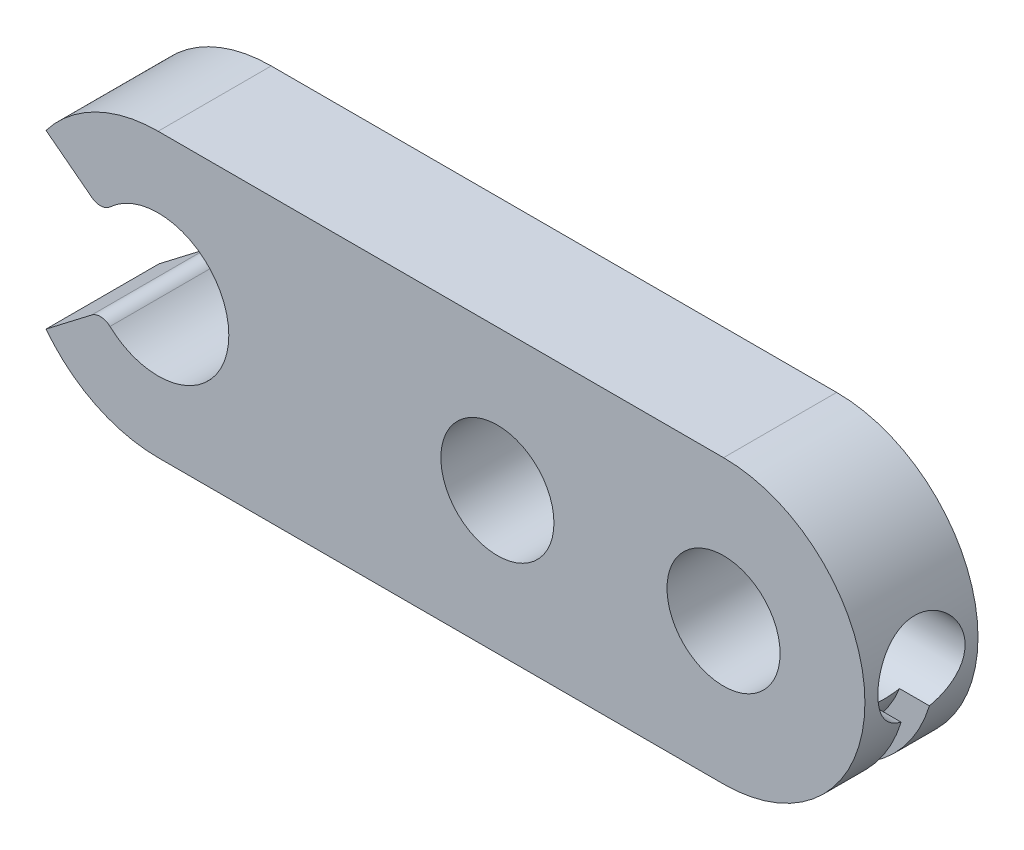
ISO-10303-21;
HEADER;
FILE_DESCRIPTION(('STEP AP214'),'2;1');
FILE_NAME('part.step','',(''),(''),'','','');
FILE_SCHEMA(('AUTOMOTIVE_DESIGN { 1 0 10303 214 1 1 1 1 }'));
ENDSEC;
DATA;
#1=APPLICATION_CONTEXT('core data for automotive mechanical design processes');
#2=APPLICATION_PROTOCOL_DEFINITION('international standard','automotive_design',2000,#1);
#3=PRODUCT_CONTEXT('',#1,'mechanical');
#4=PRODUCT('Part','Part','',(#3));
#5=PRODUCT_RELATED_PRODUCT_CATEGORY('part','',(#4));
#6=PRODUCT_DEFINITION_FORMATION('','',#4);
#7=PRODUCT_DEFINITION_CONTEXT('part definition',#1,'design');
#8=PRODUCT_DEFINITION('design','',#6,#7);
#9=PRODUCT_DEFINITION_SHAPE('','',#8);
#10=(LENGTH_UNIT() NAMED_UNIT(*) SI_UNIT(.MILLI.,.METRE.));
#11=(NAMED_UNIT(*) PLANE_ANGLE_UNIT() SI_UNIT($,.RADIAN.));
#12=(NAMED_UNIT(*) SI_UNIT($,.STERADIAN.) SOLID_ANGLE_UNIT());
#13=UNCERTAINTY_MEASURE_WITH_UNIT(LENGTH_MEASURE(1.E-05),#10,'distance_accuracy_value','');
#14=(GEOMETRIC_REPRESENTATION_CONTEXT(3) GLOBAL_UNCERTAINTY_ASSIGNED_CONTEXT((#13)) GLOBAL_UNIT_ASSIGNED_CONTEXT((#10,
#11,#12)) REPRESENTATION_CONTEXT('',''));
#15=CARTESIAN_POINT('',(0.,0.,0.));
#16=DIRECTION('',(0.,0.,1.));
#17=DIRECTION('',(1.,0.,0.));
#18=AXIS2_PLACEMENT_3D('',#15,#16,#17);
#19=CARTESIAN_POINT('',(0.,0.,4.));
#20=DIRECTION('',(0.,0.,-1.));
#21=DIRECTION('',(-1.,0.,0.));
#22=AXIS2_PLACEMENT_3D('',#19,#20,#21);
#23=CYLINDRICAL_SURFACE('',#22,5.);
#24=CARTESIAN_POINT('',(0.,0.,2.5));
#25=DIRECTION('',(0.,0.,-1.));
#26=DIRECTION('',(-1.,0.,0.));
#27=AXIS2_PLACEMENT_3D('',#24,#25,#26);
#28=CIRCLE('',#27,5.);
#29=CARTESIAN_POINT('',(0.,-4.99999999999545,2.5));
#30=VERTEX_POINT('',#29);
#31=CARTESIAN_POINT('',(-2.9999999999859,-4.0000000000191,2.5));
#32=VERTEX_POINT('',#31);
#33=EDGE_CURVE('E178',#30,#32,#28,.T.);
#34=ORIENTED_EDGE('',*,*,#33,.F.);
#35=DIRECTION('',(0.,0.,-1.));
#36=VECTOR('',#35,1.);
#37=CARTESIAN_POINT('',(0.,-5.,4.));
#38=LINE('',#37,#36);
#39=CARTESIAN_POINT('',(0.,-5.,4.));
#40=VERTEX_POINT('',#39);
#41=EDGE_CURVE('E355',#40,#30,#38,.T.);
#42=ORIENTED_EDGE('',*,*,#41,.F.);
#43=CARTESIAN_POINT('',(0.,0.,4.));
#44=DIRECTION('',(0.,0.,1.));
#45=DIRECTION('',(-1.,0.,0.));
#46=AXIS2_PLACEMENT_3D('',#43,#44,#45);
#47=CIRCLE('',#46,5.);
#48=CARTESIAN_POINT('',(-3.96676670145618,-3.04380714504359,4.));
#49=VERTEX_POINT('',#48);
#50=EDGE_CURVE('E320',#49,#40,#47,.T.);
#51=ORIENTED_EDGE('',*,*,#50,.F.);
#52=DIRECTION('',(0.,0.,-1.));
#53=VECTOR('',#52,1.);
#54=CARTESIAN_POINT('',(-3.96676670145618,-3.04380714504359,4.));
#55=LINE('',#54,#53);
#56=CARTESIAN_POINT('',(-3.96676670145618,-3.04380714504359,0.));
#57=VERTEX_POINT('',#56);
#58=EDGE_CURVE('E358',#49,#57,#55,.T.);
#59=ORIENTED_EDGE('',*,*,#58,.T.);
#60=CARTESIAN_POINT('',(0.,0.,0.));
#61=DIRECTION('',(0.,0.,1.));
#62=DIRECTION('',(-1.,0.,0.));
#63=AXIS2_PLACEMENT_3D('',#60,#61,#62);
#64=CIRCLE('',#63,5.);
#65=CARTESIAN_POINT('',(0.,-5.,0.));
#66=VERTEX_POINT('',#65);
#67=EDGE_CURVE('E336',#57,#66,#64,.T.);
#68=ORIENTED_EDGE('',*,*,#67,.T.);
#69=CARTESIAN_POINT('',(0.,-4.99999999999545,1.5));
#70=VERTEX_POINT('',#69);
#71=EDGE_CURVE('E354',#70,#66,#38,.T.);
#72=ORIENTED_EDGE('',*,*,#71,.F.);
#73=CARTESIAN_POINT('',(0.,0.,1.5));
#74=DIRECTION('',(0.,0.,-1.));
#75=DIRECTION('',(-1.,0.,0.));
#76=AXIS2_PLACEMENT_3D('',#73,#74,#75);
#77=CIRCLE('',#76,5.);
#78=CARTESIAN_POINT('',(-2.9999999999859,-4.0000000000191,1.5));
#79=VERTEX_POINT('',#78);
#80=EDGE_CURVE('E190',#70,#79,#77,.T.);
#81=ORIENTED_EDGE('',*,*,#80,.T.);
#82=DIRECTION('',(0.,0.,-1.));
#83=VECTOR('',#82,1.);
#84=CARTESIAN_POINT('',(-2.9999999999859,-4.0000000000191,2.5));
#85=LINE('',#84,#83);
#86=EDGE_CURVE('E173',#32,#79,#85,.T.);
#87=ORIENTED_EDGE('',*,*,#86,.F.);
#88=EDGE_LOOP('',(#34,#42,#51,#59,#68,#72,#81,#87));
#89=FACE_BOUND('',#88,.T.);
#90=ADVANCED_FACE('F41',(#89),#23,.T.);
#91=CARTESIAN_POINT('',(20.,-5.,4.));
#92=DIRECTION('',(0.,1.,0.));
#93=DIRECTION('',(-1.,0.,0.));
#94=AXIS2_PLACEMENT_3D('',#91,#92,#93);
#95=PLANE('',#94);
#96=DIRECTION('',(-1.,0.,0.));
#97=VECTOR('',#96,1.);
#98=CARTESIAN_POINT('',(400010.516616649,-4.99999999999545,2.5));
#99=LINE('',#98,#97);
#100=CARTESIAN_POINT('',(19.9999999999818,-4.99999999999545,2.5));
#101=VERTEX_POINT('',#100);
#102=EDGE_CURVE('E174',#101,#30,#99,.T.);
#103=ORIENTED_EDGE('',*,*,#102,.F.);
#104=DIRECTION('',(0.,0.,-1.));
#105=VECTOR('',#104,1.);
#106=CARTESIAN_POINT('',(20.,-5.,4.));
#107=LINE('',#106,#105);
#108=CARTESIAN_POINT('',(20.,-5.,4.));
#109=VERTEX_POINT('',#108);
#110=EDGE_CURVE('E351',#109,#101,#107,.T.);
#111=ORIENTED_EDGE('',*,*,#110,.F.);
#112=DIRECTION('',(1.,0.,0.));
#113=VECTOR('',#112,1.);
#114=CARTESIAN_POINT('',(20.,-5.,4.));
#115=LINE('',#114,#113);
#116=EDGE_CURVE('E322',#40,#109,#115,.T.);
#117=ORIENTED_EDGE('',*,*,#116,.F.);
#118=ORIENTED_EDGE('',*,*,#41,.T.);
#119=EDGE_LOOP('',(#103,#111,#117,#118));
#120=FACE_BOUND('',#119,.T.);
#121=ADVANCED_FACE('F244',(#120),#95,.F.);
#122=CARTESIAN_POINT('',(20.,0.,4.));
#123=DIRECTION('',(0.,0.,-1.));
#124=DIRECTION('',(-1.,0.,0.));
#125=AXIS2_PLACEMENT_3D('',#122,#123,#124);
#126=CYLINDRICAL_SURFACE('',#125,5.);
#127=CARTESIAN_POINT('',(19.9999999999999,0.,2.5));
#128=DIRECTION('',(0.,0.,-1.));
#129=DIRECTION('',(-1.,0.,0.));
#130=AXIS2_PLACEMENT_3D('',#127,#128,#129);
#131=CIRCLE('',#130,5.00000000000005);
#132=CARTESIAN_POINT('',(24.7819280564956,-1.46053553962237,2.5));
#133=VERTEX_POINT('',#132);
#134=EDGE_CURVE('E164',#133,#101,#131,.T.);
#135=ORIENTED_EDGE('',*,*,#134,.F.);
#136=CARTESIAN_POINT('',(25.,0.,0.45625));
#137=CARTESIAN_POINT('',(24.999999480161,-0.0845729065723781,0.456250700694102));
#138=CARTESIAN_POINT('',(24.9978338939525,-0.169152999162136,0.463222816589825));
#139=CARTESIAN_POINT('',(24.9894069250978,-0.335842868806745,0.490856070646756));
#140=CARTESIAN_POINT('',(24.9831445263833,-0.41795202774902,0.511520604740073));
#141=CARTESIAN_POINT('',(24.9672086823788,-0.577272076851462,0.565777692587159));
#142=CARTESIAN_POINT('',(24.957540444089,-0.654490233165572,0.599350518690638));
#143=CARTESIAN_POINT('',(24.9357931907344,-0.802201083794746,0.678388167957652));
#144=CARTESIAN_POINT('',(24.9237138135048,-0.872692765406398,0.723854777944919));
#145=CARTESIAN_POINT('',(24.8980200250978,-1.00708063661375,0.826836468076737));
#146=CARTESIAN_POINT('',(24.8843727678398,-1.0707449200213,0.884645955496643));
#147=CARTESIAN_POINT('',(24.8572733152295,-1.18764645332459,1.010045360376));
#148=CARTESIAN_POINT('',(24.8438211555132,-1.2408818199695,1.07763704047635));
#149=CARTESIAN_POINT('',(24.8182840618331,-1.33666051876377,1.22267596990992));
#150=CARTESIAN_POINT('',(24.80623975242,-1.37891616598629,1.3003210258804));
#151=CARTESIAN_POINT('',(24.785375138051,-1.44967426037488,1.46204718214678));
#152=CARTESIAN_POINT('',(24.7765540069306,-1.47818023245554,1.5461266264894));
#153=CARTESIAN_POINT('',(24.7634776916362,-1.51978496593613,1.71572177675759));
#154=CARTESIAN_POINT('',(24.7590955815632,-1.53331311738559,1.80112208975003));
#155=CARTESIAN_POINT('',(24.7550163912293,-1.54591947647336,1.97308401082649));
#156=CARTESIAN_POINT('',(24.7553180993751,-1.54500142100368,2.05964531280164));
#157=CARTESIAN_POINT('',(24.7604602813702,-1.52907770010458,2.22793855572346));
#158=CARTESIAN_POINT('',(24.7651256645235,-1.51461546122583,2.30972816137542));
#159=CARTESIAN_POINT('',(24.7781854439269,-1.47289405384302,2.46965823047739));
#160=CARTESIAN_POINT('',(24.7865802278651,-1.44563355488528,2.5477983136095));
#161=CARTESIAN_POINT('',(24.8062887948088,-1.37870069680178,2.69951629328917));
#162=CARTESIAN_POINT('',(24.817642699728,-1.33885600191178,2.77301272577578));
#163=CARTESIAN_POINT('',(24.8419715534828,-1.24800550917216,2.91245568815029));
#164=CARTESIAN_POINT('',(24.8549469145639,-1.19699687046957,2.97840028983008));
#165=CARTESIAN_POINT('',(24.8817614365823,-1.08259000940464,3.10394294294383));
#166=CARTESIAN_POINT('',(24.8956133785546,-1.01874244865618,3.16312952164541));
#167=CARTESIAN_POINT('',(24.9221117577271,-0.881855654020937,3.27005421620226));
#168=CARTESIAN_POINT('',(24.9347581097848,-0.808815771787742,3.31779152383478));
#169=CARTESIAN_POINT('',(24.9575478196569,-0.654838425029483,3.40073252772727));
#170=CARTESIAN_POINT('',(24.9676718221456,-0.573846161943832,3.43584016895336));
#171=CARTESIAN_POINT('',(24.984136496504,-0.406720611753869,3.49181162994091));
#172=CARTESIAN_POINT('',(24.9904782885832,-0.320588855179556,3.51267966743167));
#173=CARTESIAN_POINT('',(24.9984846712894,-0.149123586978733,3.53888346164954));
#174=CARTESIAN_POINT('',(25.0003169747413,-0.0638829375525798,3.54477644177353));
#175=CARTESIAN_POINT('',(24.9995927364374,0.106377280249304,3.54243111222472));
#176=CARTESIAN_POINT('',(24.9970368188936,0.191396878346087,3.53419481240207));
#177=CARTESIAN_POINT('',(24.9879334079754,0.356666327838328,3.50427306210431));
#178=CARTESIAN_POINT('',(24.9814838469478,0.436981790536984,3.48291736404679));
#179=CARTESIAN_POINT('',(24.9653451903379,0.592868735146109,3.42776368089384));
#180=CARTESIAN_POINT('',(24.9556556976617,0.668439634202228,3.39396417060336));
#181=CARTESIAN_POINT('',(24.9337462484158,0.814709872566847,3.31397374316787));
#182=CARTESIAN_POINT('',(24.921471116207,0.885248660022374,3.26750476701442));
#183=CARTESIAN_POINT('',(24.8957957892693,1.0177149526685,3.16382938128706));
#184=CARTESIAN_POINT('',(24.8823952968795,1.07964016796725,3.10662012590441));
#185=CARTESIAN_POINT('',(24.85532905741,1.19560265215683,2.98046797536102));
#186=CARTESIAN_POINT('',(24.8416730511362,1.24924295894475,2.91115727343023));
#187=CARTESIAN_POINT('',(24.8161858065621,1.34416450724963,2.7642214790745));
#188=CARTESIAN_POINT('',(24.8043545330687,1.38544598714272,2.68659654705301));
#189=CARTESIAN_POINT('',(24.7839893236732,1.45421280196384,2.52542423230541));
#190=CARTESIAN_POINT('',(24.7754417996762,1.48175513372458,2.44190298625955));
#191=CARTESIAN_POINT('',(24.7626767312399,1.52229128462226,2.27109166374474));
#192=CARTESIAN_POINT('',(24.7584575896927,1.53529047012161,2.18380298979778));
#193=CARTESIAN_POINT('',(24.7549906777441,1.54599210981458,2.01207645322102));
#194=CARTESIAN_POINT('',(24.7555316673266,1.54434450878359,1.92768284911403));
#195=CARTESIAN_POINT('',(24.7610125054912,1.52736299795699,1.76043697663767));
#196=CARTESIAN_POINT('',(24.7659521579407,1.51202969839496,1.67758463971265));
#197=CARTESIAN_POINT('',(24.7795279098159,1.46854249341571,1.51690500750902));
#198=CARTESIAN_POINT('',(24.7881115038867,1.44057034558163,1.43902375128254));
#199=CARTESIAN_POINT('',(24.8079956942771,1.37274205157493,1.28899762966045));
#200=CARTESIAN_POINT('',(24.8192968335699,1.33288353008821,1.21685391448014));
#201=CARTESIAN_POINT('',(24.8438830073561,1.24062731906766,1.0773594547971));
#202=CARTESIAN_POINT('',(24.8572274600914,1.18780774070674,1.01029822411448));
#203=CARTESIAN_POINT('',(24.8841188576801,1.0718762890508,0.885780594623897));
#204=CARTESIAN_POINT('',(24.8976658553231,1.00876168852834,0.828326749072852));
#205=CARTESIAN_POINT('',(24.9239493873929,0.871631425882561,0.722839837461087));
#206=CARTESIAN_POINT('',(24.9366467855077,0.797334321458239,0.675161824925949));
#207=CARTESIAN_POINT('',(24.9593160346644,0.641387290746908,0.593037234633079));
#208=CARTESIAN_POINT('',(24.9692890192516,0.559740441321793,0.558585151543786));
#209=CARTESIAN_POINT('',(24.984636930114,0.399121989678414,0.506571758407921));
#210=CARTESIAN_POINT('',(24.9903487982078,0.320587914377019,0.487754468974514));
#211=CARTESIAN_POINT('',(24.9980302234816,0.161371130640183,0.462594447707737));
#212=CARTESIAN_POINT('',(25.000000495965,0.0806888358841076,0.456249331485772));
#213=CARTESIAN_POINT('',(25.,0.,0.45625));
#214=B_SPLINE_CURVE_WITH_KNOTS('',3,(#136,#137,#138,#139,#140,#141,#142,#143,#144,#145,#146,
#147,#148,#149,#150,#151,#152,#153,#154,#155,#156,#157,#158,#159,#160,#161,#162,#163,#164,#165,
#166,#167,#168,#169,#170,#171,#172,#173,#174,#175,#176,#177,#178,#179,#180,#181,#182,#183,#184,
#185,#186,#187,#188,#189,#190,#191,#192,#193,#194,#195,#196,#197,#198,#199,#200,#201,#202,#203,
#204,#205,#206,#207,#208,#209,#210,#211,#212,#213),.UNSPECIFIED.,.T.,.F.,(4,2,2,2,2,2,2,2,2,2,2,
2,2,2,2,2,2,2,2,2,2,2,2,2,2,2,2,2,2,2,2,2,2,2,2,2,2,2,4),(0.,0.253422193859094,
0.506907263891106,0.760006464566524,1.01314371063132,1.27317493356997,1.53325306967663,
1.79958117898429,2.06584097515378,2.32425222442591,2.58259662991971,2.83100038161667,
3.07942996205033,3.33142107036855,3.58347637676507,3.84671643843139,4.10997507717824,
4.37519559083977,4.64033751281548,4.89545858500385,5.15054336994955,5.3994650603153,
5.64841727031451,5.90334742570326,6.15834522449277,6.4231903918977,6.6880304506596,
6.95176248891108,7.21539717897253,7.46739365717315,7.71937889962787,7.96785035101046,
8.21637148900968,8.47441378363506,8.73252454691843,8.99879132914176,9.26494715655483,
9.50677699323151,9.74856059318603),.UNSPECIFIED.);
#215=CARTESIAN_POINT('',(24.7819280564958,-1.4605355396225,1.49999999999961));
#216=VERTEX_POINT('',#215);
#217=EDGE_CURVE('E196',#133,#216,#214,.T.);
#218=ORIENTED_EDGE('',*,*,#217,.T.);
#219=CARTESIAN_POINT('',(19.9999999999999,0.,1.5));
#220=DIRECTION('',(0.,0.,-1.));
#221=DIRECTION('',(-1.,0.,0.));
#222=AXIS2_PLACEMENT_3D('',#219,#220,#221);
#223=CIRCLE('',#222,5.00000000000005);
#224=CARTESIAN_POINT('',(19.9999999999818,-4.99999999999545,1.5));
#225=VERTEX_POINT('',#224);
#226=EDGE_CURVE('E56',#216,#225,#223,.T.);
#227=ORIENTED_EDGE('',*,*,#226,.T.);
#228=CARTESIAN_POINT('',(20.,-5.,0.));
#229=VERTEX_POINT('',#228);
#230=EDGE_CURVE('E350',#225,#229,#107,.T.);
#231=ORIENTED_EDGE('',*,*,#230,.T.);
#232=CARTESIAN_POINT('',(20.,0.,0.));
#233=DIRECTION('',(0.,0.,1.));
#234=DIRECTION('',(-1.,0.,0.));
#235=AXIS2_PLACEMENT_3D('',#232,#233,#234);
#236=CIRCLE('',#235,5.);
#237=CARTESIAN_POINT('',(20.,5.,0.));
#238=VERTEX_POINT('',#237);
#239=EDGE_CURVE('E342',#229,#238,#236,.T.);
#240=ORIENTED_EDGE('',*,*,#239,.T.);
#241=DIRECTION('',(0.,0.,-1.));
#242=VECTOR('',#241,1.);
#243=CARTESIAN_POINT('',(20.,5.,4.));
#244=LINE('',#243,#242);
#245=CARTESIAN_POINT('',(20.,5.,4.));
#246=VERTEX_POINT('',#245);
#247=EDGE_CURVE('E347',#246,#238,#244,.T.);
#248=ORIENTED_EDGE('',*,*,#247,.F.);
#249=CARTESIAN_POINT('',(20.,0.,4.));
#250=DIRECTION('',(0.,0.,1.));
#251=DIRECTION('',(-1.,0.,0.));
#252=AXIS2_PLACEMENT_3D('',#249,#250,#251);
#253=CIRCLE('',#252,5.);
#254=EDGE_CURVE('E324',#109,#246,#253,.T.);
#255=ORIENTED_EDGE('',*,*,#254,.F.);
#256=ORIENTED_EDGE('',*,*,#110,.T.);
#257=EDGE_LOOP('',(#135,#218,#227,#231,#240,#248,#255,#256));
#258=FACE_BOUND('',#257,.T.);
#259=ADVANCED_FACE('F207',(#258),#126,.T.);
#260=CARTESIAN_POINT('',(20.,0.,2.));
#261=DIRECTION('',(1.,0.,0.));
#262=DIRECTION('',(0.,0.,-1.));
#263=AXIS2_PLACEMENT_3D('',#260,#261,#262);
#264=CYLINDRICAL_SURFACE('',#263,1.54375);
#265=CARTESIAN_POINT('',(22.,0.,0.45625));
#266=CARTESIAN_POINT('',(21.9999942712638,0.0748743024289015,0.456255930589099));
#267=CARTESIAN_POINT('',(21.9957545429103,0.149813279878491,0.461738053566117));
#268=CARTESIAN_POINT('',(21.9791815940654,0.297269228496556,0.483303102917119));
#269=CARTESIAN_POINT('',(21.9668366468347,0.369782530167421,0.499401389047384));
#270=CARTESIAN_POINT('',(21.9352309288213,0.509915581839783,0.541073712589252));
#271=CARTESIAN_POINT('',(21.9160103822364,0.57756110108138,0.566592663661677));
#272=CARTESIAN_POINT('',(21.872069831545,0.707136643188832,0.625880318552911));
#273=CARTESIAN_POINT('',(21.8473499369036,0.769066779785256,0.659648858164122));
#274=CARTESIAN_POINT('',(21.7914196465507,0.892075136332761,0.73779334861779));
#275=CARTESIAN_POINT('',(21.7598178823223,0.952528180676472,0.782867293360769));
#276=CARTESIAN_POINT('',(21.6938159047702,1.06549404069248,0.880416509424512));
#277=CARTESIAN_POINT('',(21.6594117305761,1.11799530717064,0.932902336147567));
#278=CARTESIAN_POINT('',(21.5824357043339,1.22520439921079,1.05654333124097));
#279=CARTESIAN_POINT('',(21.5396962245748,1.27796563956589,1.12928737205633));
#280=CARTESIAN_POINT('',(21.4576583163319,1.37078233012692,1.28427307227703));
#281=CARTESIAN_POINT('',(21.4183559942798,1.41085229541916,1.36650373379568));
#282=CARTESIAN_POINT('',(21.3619497833828,1.46493815999436,1.50939899701249));
#283=CARTESIAN_POINT('',(21.3419262234205,1.48315016160879,1.56730707086567));
#284=CARTESIAN_POINT('',(21.3083619442894,1.51284260023363,1.68658055223406));
#285=CARTESIAN_POINT('',(21.2948060021076,1.52433885874582,1.74793745745691));
#286=CARTESIAN_POINT('',(21.2762932944738,1.53988187492583,1.87363457604204));
#287=CARTESIAN_POINT('',(21.2714311495704,1.54384669138489,1.93799988381644));
#288=CARTESIAN_POINT('',(21.271670478987,1.54364972267649,2.06670576071697));
#289=CARTESIAN_POINT('',(21.2767722122655,1.53948772629524,2.13104632915666));
#290=CARTESIAN_POINT('',(21.2945914222284,1.52451218476544,2.2492460005361));
#291=CARTESIAN_POINT('',(21.3062541671519,1.51461505338235,2.30339502888942));
#292=CARTESIAN_POINT('',(21.3347538200482,1.48956150832722,2.40905106900025));
#293=CARTESIAN_POINT('',(21.3515964792074,1.47439924642625,2.46055506947122));
#294=CARTESIAN_POINT('',(21.4011034039235,1.42782582592799,2.59347123709937));
#295=CARTESIAN_POINT('',(21.4368870418672,1.39228701103556,2.67226969350238));
#296=CARTESIAN_POINT('',(21.512497757386,1.30977320448314,2.82155992863933));
#297=CARTESIAN_POINT('',(21.5523350197084,1.26276897069178,2.89202977226134));
#298=CARTESIAN_POINT('',(21.6333747636022,1.15616850324576,3.02666908482932));
#299=CARTESIAN_POINT('',(21.6745778526226,1.09620018038759,3.09054488298609));
#300=CARTESIAN_POINT('',(21.7534111136553,0.965083810355809,3.20809920180742));
#301=CARTESIAN_POINT('',(21.7910474876375,0.893955762411698,3.26179559187995));
#302=CARTESIAN_POINT('',(21.853389974418,0.754770454287773,3.348686926556));
#303=CARTESIAN_POINT('',(21.8792049088998,0.688433565466886,3.3838306225049));
#304=CARTESIAN_POINT('',(21.924422009528,0.549476883078331,3.44463786470592));
#305=CARTESIAN_POINT('',(21.9438276908109,0.476860561116324,3.47030660838001));
#306=CARTESIAN_POINT('',(21.9746857212223,0.326415748775377,3.51086826548232));
#307=CARTESIAN_POINT('',(21.9860797178106,0.248553453440683,3.52568215049855));
#308=CARTESIAN_POINT('',(21.9995086476465,0.0906889407057967,3.54312394727354));
#309=CARTESIAN_POINT('',(22.00154980137,0.0106881812036059,3.54575995841576));
#310=CARTESIAN_POINT('',(21.9964037742314,-0.138953793714421,3.53908847304869));
#311=CARTESIAN_POINT('',(21.990280578442,-0.208700118753145,3.53115808854764));
#312=CARTESIAN_POINT('',(21.9711341954697,-0.345549815425173,3.50618668293394));
#313=CARTESIAN_POINT('',(21.9581099003446,-0.412652760816147,3.48914419890855));
#314=CARTESIAN_POINT('',(21.9259023054529,-0.543616176178308,3.44653410410538));
#315=CARTESIAN_POINT('',(21.9066328593958,-0.607415899200105,3.42084704687133));
#316=CARTESIAN_POINT('',(21.8632614250098,-0.729706790190378,3.36209369372459));
#317=CARTESIAN_POINT('',(21.8391586102875,-0.788197047876206,3.32902613580868));
#318=CARTESIAN_POINT('',(21.7833027627834,-0.908231289712856,3.25068329353916));
#319=CARTESIAN_POINT('',(21.7509427242913,-0.968767251648546,3.20430137853333));
#320=CARTESIAN_POINT('',(21.6835397465719,-1.08167908723432,3.1040153445819));
#321=CARTESIAN_POINT('',(21.6484921844648,-1.13404040765932,3.0500981267554));
#322=CARTESIAN_POINT('',(21.5705730174327,-1.24035828427736,2.92351180140333));
#323=CARTESIAN_POINT('',(21.5275918985943,-1.29237654329316,2.84927584241585));
#324=CARTESIAN_POINT('',(21.4456708244092,-1.38338668474254,2.69116157788897));
#325=CARTESIAN_POINT('',(21.4067245134527,-1.42239927548688,2.60729888959108));
#326=CARTESIAN_POINT('',(21.3522791404091,-1.47383526930397,2.46308534328402));
#327=CARTESIAN_POINT('',(21.3334498410003,-1.49074998451096,2.40561153246602));
#328=CARTESIAN_POINT('',(21.3023956058953,-1.51795717422888,2.28745234821792));
#329=CARTESIAN_POINT('',(21.2901546229593,-1.52826575118491,2.22677517714529));
#330=CARTESIAN_POINT('',(21.2742152045947,-1.5415889071855,2.10284391915665));
#331=CARTESIAN_POINT('',(21.2706004166619,-1.54453207773441,2.03957060388642));
#332=CARTESIAN_POINT('',(21.2729333574804,-1.54260833656093,1.91330916281934));
#333=CARTESIAN_POINT('',(21.2788853833195,-1.53773791524024,1.85032117792824));
#334=CARTESIAN_POINT('',(21.3000504248968,-1.51989019439224,1.72119266008144));
#335=CARTESIAN_POINT('',(21.316055832962,-1.50621644479117,1.65528576344893));
#336=CARTESIAN_POINT('',(21.3550673893622,-1.47121545259394,1.52767344619445));
#337=CARTESIAN_POINT('',(21.3780923009329,-1.44986766945702,1.46597983546392));
#338=CARTESIAN_POINT('',(21.439143498305,-1.38974543938403,1.32157143697583));
#339=CARTESIAN_POINT('',(21.4793560224558,-1.34742613677537,1.2412715237735));
#340=CARTESIAN_POINT('',(21.5623143830957,-1.25031157344132,1.09007181464789));
#341=CARTESIAN_POINT('',(21.6050636741051,-1.19549899721245,1.01918528340042));
#342=CARTESIAN_POINT('',(21.6898889513471,-1.07238344799459,0.885732399833632));
#343=CARTESIAN_POINT('',(21.731923393055,-1.00378526013695,0.823409829797768));
#344=CARTESIAN_POINT('',(21.8102379206953,-0.854464817282181,0.710913171861693));
#345=CARTESIAN_POINT('',(21.8465299201642,-0.773768358193019,0.660713815534071));
#346=CARTESIAN_POINT('',(21.9014872934177,-0.623698477671113,0.586042691074873));
#347=CARTESIAN_POINT('',(21.9222857249128,-0.556743038969557,0.558274545504781));
#348=CARTESIAN_POINT('',(21.9571182680609,-0.418051699097188,0.512146717812244));
#349=CARTESIAN_POINT('',(21.9711662003965,-0.346325910464052,0.493767807656276));
#350=CARTESIAN_POINT('',(21.987434393635,-0.228381963841029,0.472556427298251));
#351=CARTESIAN_POINT('',(21.9921288826222,-0.183062246040755,0.466458879100158));
#352=CARTESIAN_POINT('',(21.9984137690644,-0.0918365453660068,0.458303421978206));
#353=CARTESIAN_POINT('',(22.0000035142015,-0.0459304413284918,0.456246361975126));
#354=CARTESIAN_POINT('',(22.,0.,0.45625));
#355=B_SPLINE_CURVE_WITH_KNOTS('',3,(#265,#266,#267,#268,#269,#270,#271,#272,#273,#274,#275,
#276,#277,#278,#279,#280,#281,#282,#283,#284,#285,#286,#287,#288,#289,#290,#291,#292,#293,#294,
#295,#296,#297,#298,#299,#300,#301,#302,#303,#304,#305,#306,#307,#308,#309,#310,#311,#312,#313,
#314,#315,#316,#317,#318,#319,#320,#321,#322,#323,#324,#325,#326,#327,#328,#329,#330,#331,#332,
#333,#334,#335,#336,#337,#338,#339,#340,#341,#342,#343,#344,#345,#346,#347,#348,#349,#350,#351,
#352,#353,#354),.UNSPECIFIED.,.T.,.F.,(4,2,2,2,2,2,2,2,2,2,2,2,2,2,2,2,2,2,2,2,2,2,2,2,2,2,2,2,
2,2,2,2,2,2,2,2,2,2,2,2,2,2,2,2,4),(0.,0.224428587648724,0.449182599241246,0.672642681219942,
0.896098315600597,1.14052084731186,1.38529504351416,1.68262503181405,1.97961372371614,
2.17077445480222,2.36148299826756,2.55425480293044,2.74703161774992,2.91521232234761,
3.08358043390206,3.36270766575889,3.64255438496787,3.93186524828788,4.22066344111581,
4.45788260737564,4.69497145458305,4.93376971895977,5.17240913808656,5.38279462436618,
5.59321389737798,5.80666893237565,6.02016049438039,6.26780072526832,6.5158769198889,
6.81561125103036,7.11486602414053,7.30265813438874,7.48999074306713,7.67913264785759,
7.86835953251311,8.07478132945014,8.28175980595137,8.57804075955135,8.87473487874596,
9.17863221215747,9.48189055691291,9.70723078916199,9.9321076828008,10.0697508882879,
10.2074230100045),.UNSPECIFIED.);
#356=CARTESIAN_POINT('',(22.,0.,0.45625));
#357=VERTEX_POINT('',#356);
#358=EDGE_CURVE('E195',#357,#357,#355,.T.);
#359=ORIENTED_EDGE('',*,*,#358,.F.);
#360=EDGE_LOOP('',(#359));
#361=FACE_BOUND('',#360,.T.);
#362=DIRECTION('',(1.,0.,0.));
#363=VECTOR('',#362,1.);
#364=CARTESIAN_POINT('',(20.,-1.46053553962237,2.5));
#365=LINE('',#364,#363);
#366=CARTESIAN_POINT('',(23.723820073191,-1.46053553962237,2.5));
#367=VERTEX_POINT('',#366);
#368=EDGE_CURVE('E11',#367,#133,#365,.T.);
#369=ORIENTED_EDGE('',*,*,#368,.F.);
#370=CARTESIAN_POINT('',(23.723820073191,-1.46053553962237,1.5));
#371=CARTESIAN_POINT('',(23.7186273934928,-1.47376762170241,1.53864737628285));
#372=CARTESIAN_POINT('',(23.713955504126,-1.4854798195782,1.57787261928587));
#373=CARTESIAN_POINT('',(23.7057739965253,-1.50577646263413,1.65724692976874));
#374=CARTESIAN_POINT('',(23.7022645166508,-1.51436053549155,1.69739610661489));
#375=CARTESIAN_POINT('',(23.6938349617324,-1.53486476356324,1.81643160660848));
#376=CARTESIAN_POINT('',(23.6906890696557,-1.54233800769049,1.8962609417276));
#377=CARTESIAN_POINT('',(23.6896144248014,-1.5449135457693,2.06384964764792));
#378=CARTESIAN_POINT('',(23.6922145784716,-1.53876156421099,2.15163577643618));
#379=CARTESIAN_POINT('',(23.7006364029983,-1.51833289579848,2.28263438930599));
#380=CARTESIAN_POINT('',(23.704296017779,-1.5094143455672,2.32690008149644));
#381=CARTESIAN_POINT('',(23.7130338959395,-1.48778717866369,2.4143416298459));
#382=CARTESIAN_POINT('',(23.718111797026,-1.47507952983988,2.45751776126016));
#383=CARTESIAN_POINT('',(23.723820073191,-1.46053553962237,2.5));
#384=B_SPLINE_CURVE_WITH_KNOTS('',3,(#370,#371,#372,#373,#374,#375,#376,#377,#378,#379,#380,
#381,#382,#383),.UNSPECIFIED.,.F.,.F.,(4,2,2,2,2,2,4),(0.,0.123474442850241,0.246963577356968,
0.486512641838173,0.749020081958602,0.884760420577215,1.02046611673681),.UNSPECIFIED.);
#385=CARTESIAN_POINT('',(23.723820073191,-1.46053553962237,1.5));
#386=VERTEX_POINT('',#385);
#387=EDGE_CURVE('E49',#386,#367,#384,.T.);
#388=ORIENTED_EDGE('',*,*,#387,.F.);
#389=DIRECTION('',(1.,0.,0.));
#390=VECTOR('',#389,1.);
#391=CARTESIAN_POINT('',(20.,-1.46053553962237,1.5));
#392=LINE('',#391,#390);
#393=EDGE_CURVE('E233',#386,#216,#392,.T.);
#394=ORIENTED_EDGE('',*,*,#393,.T.);
#395=ORIENTED_EDGE('',*,*,#217,.F.);
#396=EDGE_LOOP('',(#369,#388,#394,#395));
#397=FACE_BOUND('',#396,.T.);
#398=ADVANCED_FACE('F211',(#361,#397),#264,.F.);
#399=CARTESIAN_POINT('',(0.,0.,4.));
#400=DIRECTION('',(0.,0.,-1.));
#401=DIRECTION('',(-1.,0.,0.));
#402=AXIS2_PLACEMENT_3D('',#399,#400,#401);
#403=CYLINDRICAL_SURFACE('',#402,5.);
#404=CARTESIAN_POINT('',(0.,0.,0.));
#405=DIRECTION('',(0.,0.,1.));
#406=DIRECTION('',(-1.,0.,0.));
#407=AXIS2_PLACEMENT_3D('',#404,#405,#406);
#408=CIRCLE('',#407,5.);
#409=CARTESIAN_POINT('',(0.,5.,0.));
#410=VERTEX_POINT('',#409);
#411=CARTESIAN_POINT('',(-3.96676670145618,3.04380714504359,0.));
#412=VERTEX_POINT('',#411);
#413=EDGE_CURVE('E297',#410,#412,#408,.T.);
#414=ORIENTED_EDGE('',*,*,#413,.T.);
#415=DIRECTION('',(0.,0.,-1.));
#416=VECTOR('',#415,1.);
#417=CARTESIAN_POINT('',(-3.96676670145618,3.04380714504359,4.));
#418=LINE('',#417,#416);
#419=CARTESIAN_POINT('',(-3.96676670145618,3.04380714504359,4.));
#420=VERTEX_POINT('',#419);
#421=EDGE_CURVE('E361',#420,#412,#418,.T.);
#422=ORIENTED_EDGE('',*,*,#421,.F.);
#423=CARTESIAN_POINT('',(0.,0.,4.));
#424=DIRECTION('',(0.,0.,1.));
#425=DIRECTION('',(-1.,0.,0.));
#426=AXIS2_PLACEMENT_3D('',#423,#424,#425);
#427=CIRCLE('',#426,5.);
#428=CARTESIAN_POINT('',(0.,5.,4.));
#429=VERTEX_POINT('',#428);
#430=EDGE_CURVE('E310',#429,#420,#427,.T.);
#431=ORIENTED_EDGE('',*,*,#430,.F.);
#432=DIRECTION('',(0.,0.,-1.));
#433=VECTOR('',#432,1.);
#434=CARTESIAN_POINT('',(0.,5.,4.));
#435=LINE('',#434,#433);
#436=EDGE_CURVE('E327',#429,#410,#435,.T.);
#437=ORIENTED_EDGE('',*,*,#436,.T.);
#438=EDGE_LOOP('',(#414,#422,#431,#437));
#439=FACE_BOUND('',#438,.T.);
#440=ADVANCED_FACE('F216',(#439),#403,.T.);
#441=CARTESIAN_POINT('',(-3.96676670145618,3.04380714504359,4.));
#442=DIRECTION('',(0.60876142900872,0.793353340291236,0.));
#443=DIRECTION('',(-0.793353340291236,0.60876142900872,0.));
#444=AXIS2_PLACEMENT_3D('',#441,#442,#443);
#445=PLANE('',#444);
#446=DIRECTION('',(0.793353340291236,-0.60876142900872,0.));
#447=VECTOR('',#446,1.);
#448=CARTESIAN_POINT('',(-3.96676670145618,3.04380714504359,0.));
#449=LINE('',#448,#447);
#450=CARTESIAN_POINT('',(-2.34677082867577,1.80074059144465,0.));
#451=VERTEX_POINT('',#450);
#452=EDGE_CURVE('E302',#412,#451,#449,.T.);
#453=ORIENTED_EDGE('',*,*,#452,.T.);
#454=DIRECTION('',(0.,0.,-1.));
#455=VECTOR('',#454,1.);
#456=CARTESIAN_POINT('',(-2.34677082867577,1.80074059144465,4.));
#457=LINE('',#456,#455);
#458=CARTESIAN_POINT('',(-2.34677082867577,1.80074059144465,4.));
#459=VERTEX_POINT('',#458);
#460=EDGE_CURVE('E284',#451,#459,#457,.F.);
#461=ORIENTED_EDGE('',*,*,#460,.T.);
#462=DIRECTION('',(0.793353340291236,-0.60876142900872,0.));
#463=VECTOR('',#462,1.);
#464=CARTESIAN_POINT('',(-3.96676670145618,3.04380714504359,4.));
#465=LINE('',#464,#463);
#466=EDGE_CURVE('E313',#420,#459,#465,.T.);
#467=ORIENTED_EDGE('',*,*,#466,.F.);
#468=ORIENTED_EDGE('',*,*,#421,.T.);
#469=EDGE_LOOP('',(#453,#461,#467,#468));
#470=FACE_BOUND('',#469,.T.);
#471=ADVANCED_FACE('F260',(#470),#445,.F.);
#472=CARTESIAN_POINT('',(0.,0.,4.));
#473=DIRECTION('',(0.,0.,-1.));
#474=DIRECTION('',(-1.,0.,0.));
#475=AXIS2_PLACEMENT_3D('',#472,#473,#474);
#476=CYLINDRICAL_SURFACE('',#475,2.5);
#477=CARTESIAN_POINT('',(0.,0.,4.));
#478=DIRECTION('',(0.,0.,-1.));
#479=DIRECTION('',(-1.,0.,0.));
#480=AXIS2_PLACEMENT_3D('',#477,#478,#479);
#481=CIRCLE('',#480,2.5);
#482=CARTESIAN_POINT('',(-1.70199176180951,1.83118105132523,4.));
#483=VERTEX_POINT('',#482);
#484=CARTESIAN_POINT('',(-1.70199176180951,-1.83118105132523,4.));
#485=VERTEX_POINT('',#484);
#486=EDGE_CURVE('E316',#483,#485,#481,.T.);
#487=ORIENTED_EDGE('',*,*,#486,.F.);
#488=DIRECTION('',(0.,0.,-1.));
#489=VECTOR('',#488,1.);
#490=CARTESIAN_POINT('',(-1.70199176180951,1.83118105132523,4.));
#491=LINE('',#490,#489);
#492=CARTESIAN_POINT('',(-1.70199176180951,1.83118105132523,0.));
#493=VERTEX_POINT('',#492);
#494=EDGE_CURVE('E286',#483,#493,#491,.T.);
#495=ORIENTED_EDGE('',*,*,#494,.T.);
#496=CARTESIAN_POINT('',(0.,0.,0.));
#497=DIRECTION('',(0.,0.,-1.));
#498=DIRECTION('',(-1.,0.,0.));
#499=AXIS2_PLACEMENT_3D('',#496,#497,#498);
#500=CIRCLE('',#499,2.5);
#501=CARTESIAN_POINT('',(-1.70199176180951,-1.83118105132523,0.));
#502=VERTEX_POINT('',#501);
#503=EDGE_CURVE('E331',#493,#502,#500,.T.);
#504=ORIENTED_EDGE('',*,*,#503,.T.);
#505=DIRECTION('',(0.,0.,-1.));
#506=VECTOR('',#505,1.);
#507=CARTESIAN_POINT('',(-1.70199176180951,-1.83118105132523,4.));
#508=LINE('',#507,#506);
#509=EDGE_CURVE('E364',#502,#485,#508,.F.);
#510=ORIENTED_EDGE('',*,*,#509,.T.);
#511=EDGE_LOOP('',(#487,#495,#504,#510));
#512=FACE_BOUND('',#511,.T.);
#513=ADVANCED_FACE('F256',(#512),#476,.F.);
#514=CARTESIAN_POINT('',(-1.98338335072809,-1.52190357252179,4.));
#515=DIRECTION('',(0.60876142900872,-0.793353340291236,0.));
#516=DIRECTION('',(0.793353340291236,0.60876142900872,0.));
#517=AXIS2_PLACEMENT_3D('',#514,#515,#516);
#518=PLANE('',#517);
#519=DIRECTION('',(-0.793353340291236,-0.60876142900872,0.));
#520=VECTOR('',#519,1.);
#521=CARTESIAN_POINT('',(-1.98338335072809,-1.52190357252179,4.));
#522=LINE('',#521,#520);
#523=CARTESIAN_POINT('',(-2.34677082867577,-1.80074059144465,4.));
#524=VERTEX_POINT('',#523);
#525=EDGE_CURVE('E318',#524,#49,#522,.T.);
#526=ORIENTED_EDGE('',*,*,#525,.F.);
#527=DIRECTION('',(0.,0.,-1.));
#528=VECTOR('',#527,1.);
#529=CARTESIAN_POINT('',(-2.34677082867577,-1.80074059144465,4.));
#530=LINE('',#529,#528);
#531=CARTESIAN_POINT('',(-2.34677082867577,-1.80074059144465,0.));
#532=VERTEX_POINT('',#531);
#533=EDGE_CURVE('E289',#524,#532,#530,.T.);
#534=ORIENTED_EDGE('',*,*,#533,.T.);
#535=DIRECTION('',(-0.793353340291236,-0.60876142900872,0.));
#536=VECTOR('',#535,1.);
#537=CARTESIAN_POINT('',(-1.98338335072809,-1.52190357252179,0.));
#538=LINE('',#537,#536);
#539=EDGE_CURVE('E334',#532,#57,#538,.T.);
#540=ORIENTED_EDGE('',*,*,#539,.T.);
#541=ORIENTED_EDGE('',*,*,#58,.F.);
#542=EDGE_LOOP('',(#526,#534,#540,#541));
#543=FACE_BOUND('',#542,.T.);
#544=ADVANCED_FACE('F253',(#543),#518,.F.);
#545=ORIENTED_EDGE('',*,*,#230,.F.);
#546=DIRECTION('',(-1.,0.,0.));
#547=VECTOR('',#546,1.);
#548=CARTESIAN_POINT('',(400010.516616649,-4.99999999999545,1.5));
#549=LINE('',#548,#547);
#550=EDGE_CURVE('E179',#225,#70,#549,.T.);
#551=ORIENTED_EDGE('',*,*,#550,.T.);
#552=ORIENTED_EDGE('',*,*,#71,.T.);
#553=DIRECTION('',(1.,0.,0.));
#554=VECTOR('',#553,1.);
#555=CARTESIAN_POINT('',(20.,-5.,0.));
#556=LINE('',#555,#554);
#557=EDGE_CURVE('E339',#66,#229,#556,.T.);
#558=ORIENTED_EDGE('',*,*,#557,.T.);
#559=EDGE_LOOP('',(#545,#551,#552,#558));
#560=FACE_BOUND('',#559,.T.);
#561=ADVANCED_FACE('F251',(#560),#95,.F.);
#562=CARTESIAN_POINT('',(0.,5.,4.));
#563=DIRECTION('',(0.,-1.,0.));
#564=DIRECTION('',(1.,0.,0.));
#565=AXIS2_PLACEMENT_3D('',#562,#563,#564);
#566=PLANE('',#565);
#567=DIRECTION('',(-1.,0.,0.));
#568=VECTOR('',#567,1.);
#569=CARTESIAN_POINT('',(0.,5.,0.));
#570=LINE('',#569,#568);
#571=EDGE_CURVE('E314',#238,#410,#570,.T.);
#572=ORIENTED_EDGE('',*,*,#571,.T.);
#573=ORIENTED_EDGE('',*,*,#436,.F.);
#574=DIRECTION('',(-1.,0.,0.));
#575=VECTOR('',#574,1.);
#576=CARTESIAN_POINT('',(0.,5.,4.));
#577=LINE('',#576,#575);
#578=EDGE_CURVE('E326',#246,#429,#577,.T.);
#579=ORIENTED_EDGE('',*,*,#578,.F.);
#580=ORIENTED_EDGE('',*,*,#247,.T.);
#581=EDGE_LOOP('',(#572,#573,#579,#580));
#582=FACE_BOUND('',#581,.T.);
#583=ADVANCED_FACE('F396',(#582),#566,.F.);
#584=CARTESIAN_POINT('',(0.,0.,4.));
#585=DIRECTION('',(0.,0.,-1.));
#586=DIRECTION('',(-1.,0.,0.));
#587=AXIS2_PLACEMENT_3D('',#584,#585,#586);
#588=PLANE('',#587);
#589=CARTESIAN_POINT('',(12.,0.,4.));
#590=DIRECTION('',(0.,0.,1.));
#591=DIRECTION('',(1.,0.,0.));
#592=AXIS2_PLACEMENT_3D('',#589,#590,#591);
#593=CIRCLE('',#592,2.);
#594=CARTESIAN_POINT('',(14.,0.,4.));
#595=VERTEX_POINT('',#594);
#596=EDGE_CURVE('E204',#595,#595,#593,.T.);
#597=ORIENTED_EDGE('',*,*,#596,.F.);
#598=EDGE_LOOP('',(#597));
#599=FACE_BOUND('',#598,.T.);
#600=CARTESIAN_POINT('',(20.,0.,4.));
#601=DIRECTION('',(0.,0.,1.));
#602=DIRECTION('',(1.,0.,0.));
#603=AXIS2_PLACEMENT_3D('',#600,#601,#602);
#604=CIRCLE('',#603,2.);
#605=CARTESIAN_POINT('',(22.,0.,4.));
#606=VERTEX_POINT('',#605);
#607=EDGE_CURVE('E298',#606,#606,#604,.T.);
#608=ORIENTED_EDGE('',*,*,#607,.F.);
#609=EDGE_LOOP('',(#608));
#610=FACE_BOUND('',#609,.T.);
#611=ORIENTED_EDGE('',*,*,#466,.T.);
#612=CARTESIAN_POINT('',(-2.04239011417141,2.19741726159027,4.));
#613=DIRECTION('',(0.,0.,-1.));
#614=DIRECTION('',(-1.,0.,0.));
#615=AXIS2_PLACEMENT_3D('',#612,#613,#614);
#616=CIRCLE('',#615,0.5);
#617=EDGE_CURVE('E283',#459,#483,#616,.F.);
#618=ORIENTED_EDGE('',*,*,#617,.T.);
#619=ORIENTED_EDGE('',*,*,#486,.T.);
#620=CARTESIAN_POINT('',(-2.04239011417141,-2.19741726159027,4.));
#621=DIRECTION('',(0.,0.,-1.));
#622=DIRECTION('',(-1.,0.,0.));
#623=AXIS2_PLACEMENT_3D('',#620,#621,#622);
#624=CIRCLE('',#623,0.5);
#625=EDGE_CURVE('E64',#485,#524,#624,.F.);
#626=ORIENTED_EDGE('',*,*,#625,.T.);
#627=ORIENTED_EDGE('',*,*,#525,.T.);
#628=ORIENTED_EDGE('',*,*,#50,.T.);
#629=ORIENTED_EDGE('',*,*,#116,.T.);
#630=ORIENTED_EDGE('',*,*,#254,.T.);
#631=ORIENTED_EDGE('',*,*,#578,.T.);
#632=ORIENTED_EDGE('',*,*,#430,.T.);
#633=EDGE_LOOP('',(#611,#618,#619,#626,#627,#628,#629,#630,#631,#632));
#634=FACE_BOUND('',#633,.T.);
#635=ADVANCED_FACE('F277',(#599,#610,#634),#588,.F.);
#636=CARTESIAN_POINT('',(0.,0.,0.));
#637=DIRECTION('',(0.,0.,-1.));
#638=DIRECTION('',(-1.,0.,0.));
#639=AXIS2_PLACEMENT_3D('',#636,#637,#638);
#640=PLANE('',#639);
#641=CARTESIAN_POINT('',(12.,0.,0.));
#642=DIRECTION('',(0.,0.,1.));
#643=DIRECTION('',(1.,0.,0.));
#644=AXIS2_PLACEMENT_3D('',#641,#642,#643);
#645=CIRCLE('',#644,2.);
#646=CARTESIAN_POINT('',(14.,0.,0.));
#647=VERTEX_POINT('',#646);
#648=EDGE_CURVE('E205',#647,#647,#645,.T.);
#649=ORIENTED_EDGE('',*,*,#648,.T.);
#650=EDGE_LOOP('',(#649));
#651=FACE_BOUND('',#650,.T.);
#652=CARTESIAN_POINT('',(20.,0.,0.));
#653=DIRECTION('',(0.,0.,-1.));
#654=DIRECTION('',(-1.,0.,0.));
#655=AXIS2_PLACEMENT_3D('',#652,#653,#654);
#656=CIRCLE('',#655,2.);
#657=CARTESIAN_POINT('',(18.,0.,0.));
#658=VERTEX_POINT('',#657);
#659=EDGE_CURVE('E295',#658,#658,#656,.T.);
#660=ORIENTED_EDGE('',*,*,#659,.F.);
#661=EDGE_LOOP('',(#660));
#662=FACE_BOUND('',#661,.T.);
#663=ORIENTED_EDGE('',*,*,#503,.F.);
#664=CARTESIAN_POINT('',(-2.04239011417141,2.19741726159027,0.));
#665=DIRECTION('',(0.,0.,-1.));
#666=DIRECTION('',(-1.,0.,0.));
#667=AXIS2_PLACEMENT_3D('',#664,#665,#666);
#668=CIRCLE('',#667,0.5);
#669=EDGE_CURVE('E369',#493,#451,#668,.T.);
#670=ORIENTED_EDGE('',*,*,#669,.T.);
#671=ORIENTED_EDGE('',*,*,#452,.F.);
#672=ORIENTED_EDGE('',*,*,#413,.F.);
#673=ORIENTED_EDGE('',*,*,#571,.F.);
#674=ORIENTED_EDGE('',*,*,#239,.F.);
#675=ORIENTED_EDGE('',*,*,#557,.F.);
#676=ORIENTED_EDGE('',*,*,#67,.F.);
#677=ORIENTED_EDGE('',*,*,#539,.F.);
#678=CARTESIAN_POINT('',(-2.04239011417141,-2.19741726159027,0.));
#679=DIRECTION('',(0.,0.,-1.));
#680=DIRECTION('',(-1.,0.,0.));
#681=AXIS2_PLACEMENT_3D('',#678,#679,#680);
#682=CIRCLE('',#681,0.5);
#683=EDGE_CURVE('E367',#532,#502,#682,.T.);
#684=ORIENTED_EDGE('',*,*,#683,.T.);
#685=EDGE_LOOP('',(#663,#670,#671,#672,#673,#674,#675,#676,#677,#684));
#686=FACE_BOUND('',#685,.T.);
#687=ADVANCED_FACE('F269',(#651,#662,#686),#640,.T.);
#688=CARTESIAN_POINT('',(-2.04239011417141,2.19741726159027,4.));
#689=DIRECTION('',(0.,0.,-1.));
#690=DIRECTION('',(-1.,0.,0.));
#691=AXIS2_PLACEMENT_3D('',#688,#689,#690);
#692=CYLINDRICAL_SURFACE('',#691,0.5);
#693=ORIENTED_EDGE('',*,*,#617,.F.);
#694=ORIENTED_EDGE('',*,*,#460,.F.);
#695=ORIENTED_EDGE('',*,*,#669,.F.);
#696=ORIENTED_EDGE('',*,*,#494,.F.);
#697=EDGE_LOOP('',(#693,#694,#695,#696));
#698=FACE_BOUND('',#697,.T.);
#699=ADVANCED_FACE('F267',(#698),#692,.T.);
#700=CARTESIAN_POINT('',(-2.04239011417141,-2.19741726159027,4.));
#701=DIRECTION('',(0.,0.,-1.));
#702=DIRECTION('',(-1.,0.,0.));
#703=AXIS2_PLACEMENT_3D('',#700,#701,#702);
#704=CYLINDRICAL_SURFACE('',#703,0.5);
#705=ORIENTED_EDGE('',*,*,#625,.F.);
#706=ORIENTED_EDGE('',*,*,#509,.F.);
#707=ORIENTED_EDGE('',*,*,#683,.F.);
#708=ORIENTED_EDGE('',*,*,#533,.F.);
#709=EDGE_LOOP('',(#705,#706,#707,#708));
#710=FACE_BOUND('',#709,.T.);
#711=ADVANCED_FACE('F43',(#710),#704,.T.);
#712=CARTESIAN_POINT('',(20.,0.,-6.));
#713=DIRECTION('',(0.,0.,1.));
#714=DIRECTION('',(1.,0.,0.));
#715=AXIS2_PLACEMENT_3D('',#712,#713,#714);
#716=CYLINDRICAL_SURFACE('',#715,2.);
#717=ORIENTED_EDGE('',*,*,#358,.T.);
#718=EDGE_LOOP('',(#717));
#719=FACE_BOUND('',#718,.T.);
#720=ORIENTED_EDGE('',*,*,#659,.T.);
#721=EDGE_LOOP('',(#720));
#722=FACE_BOUND('',#721,.T.);
#723=ORIENTED_EDGE('',*,*,#607,.T.);
#724=EDGE_LOOP('',(#723));
#725=FACE_BOUND('',#724,.T.);
#726=ADVANCED_FACE('F275',(#719,#722,#725),#716,.F.);
#727=CARTESIAN_POINT('',(12.,0.,0.));
#728=DIRECTION('',(0.,0.,1.));
#729=DIRECTION('',(1.,0.,0.));
#730=AXIS2_PLACEMENT_3D('',#727,#728,#729);
#731=CYLINDRICAL_SURFACE('',#730,2.);
#732=ORIENTED_EDGE('',*,*,#648,.F.);
#733=EDGE_LOOP('',(#732));
#734=FACE_BOUND('',#733,.T.);
#735=ORIENTED_EDGE('',*,*,#596,.T.);
#736=EDGE_LOOP('',(#735));
#737=FACE_BOUND('',#736,.T.);
#738=ADVANCED_FACE('F219',(#734,#737),#731,.F.);
#739=CARTESIAN_POINT('',(20.,0.,2.5));
#740=DIRECTION('',(0.,0.,-1.));
#741=DIRECTION('',(-1.,0.,0.));
#742=AXIS2_PLACEMENT_3D('',#739,#740,#741);
#743=CYLINDRICAL_SURFACE('',#742,4.);
#744=ORIENTED_EDGE('',*,*,#387,.T.);
#745=CARTESIAN_POINT('',(20.,0.,2.5));
#746=DIRECTION('',(0.,0.,-1.));
#747=DIRECTION('',(-1.,0.,0.));
#748=AXIS2_PLACEMENT_3D('',#745,#746,#747);
#749=CIRCLE('',#748,4.);
#750=CARTESIAN_POINT('',(20.0000000000387,-4.,2.5));
#751=VERTEX_POINT('',#750);
#752=EDGE_CURVE('E154',#367,#751,#749,.T.);
#753=ORIENTED_EDGE('',*,*,#752,.T.);
#754=DIRECTION('',(0.,0.,-1.));
#755=VECTOR('',#754,1.);
#756=CARTESIAN_POINT('',(20.0000000000387,-4.,2.5));
#757=LINE('',#756,#755);
#758=CARTESIAN_POINT('',(20.0000000000387,-4.,1.5));
#759=VERTEX_POINT('',#758);
#760=EDGE_CURVE('E158',#751,#759,#757,.T.);
#761=ORIENTED_EDGE('',*,*,#760,.T.);
#762=CARTESIAN_POINT('',(20.,0.,1.5));
#763=DIRECTION('',(0.,0.,-1.));
#764=DIRECTION('',(-1.,0.,0.));
#765=AXIS2_PLACEMENT_3D('',#762,#763,#764);
#766=CIRCLE('',#765,4.);
#767=EDGE_CURVE('E187',#386,#759,#766,.T.);
#768=ORIENTED_EDGE('',*,*,#767,.F.);
#769=EDGE_LOOP('',(#744,#753,#761,#768));
#770=FACE_BOUND('',#769,.T.);
#771=ADVANCED_FACE('F156',(#770),#743,.T.);
#772=CARTESIAN_POINT('',(20.,0.,2.5));
#773=DIRECTION('',(0.,0.,-1.));
#774=DIRECTION('',(-1.,0.,0.));
#775=AXIS2_PLACEMENT_3D('',#772,#773,#774);
#776=PLANE('',#775);
#777=ORIENTED_EDGE('',*,*,#33,.T.);
#778=DIRECTION('',(1.,0.,0.));
#779=VECTOR('',#778,1.);
#780=CARTESIAN_POINT('',(400010.516616649,-4.0000000000191,2.5));
#781=LINE('',#780,#779);
#782=EDGE_CURVE('E165',#32,#751,#781,.T.);
#783=ORIENTED_EDGE('',*,*,#782,.T.);
#784=ORIENTED_EDGE('',*,*,#752,.F.);
#785=ORIENTED_EDGE('',*,*,#368,.T.);
#786=ORIENTED_EDGE('',*,*,#134,.T.);
#787=ORIENTED_EDGE('',*,*,#102,.T.);
#788=EDGE_LOOP('',(#777,#783,#784,#785,#786,#787));
#789=FACE_BOUND('',#788,.T.);
#790=ADVANCED_FACE('F176',(#789),#776,.T.);
#791=CARTESIAN_POINT('',(20.,0.,1.5));
#792=DIRECTION('',(0.,0.,-1.));
#793=DIRECTION('',(-1.,0.,0.));
#794=AXIS2_PLACEMENT_3D('',#791,#792,#793);
#795=PLANE('',#794);
#796=ORIENTED_EDGE('',*,*,#550,.F.);
#797=ORIENTED_EDGE('',*,*,#226,.F.);
#798=ORIENTED_EDGE('',*,*,#393,.F.);
#799=ORIENTED_EDGE('',*,*,#767,.T.);
#800=DIRECTION('',(1.,0.,0.));
#801=VECTOR('',#800,1.);
#802=CARTESIAN_POINT('',(400010.516616649,-4.0000000000191,1.5));
#803=LINE('',#802,#801);
#804=EDGE_CURVE('E172',#79,#759,#803,.T.);
#805=ORIENTED_EDGE('',*,*,#804,.F.);
#806=ORIENTED_EDGE('',*,*,#80,.F.);
#807=EDGE_LOOP('',(#796,#797,#798,#799,#805,#806));
#808=FACE_BOUND('',#807,.T.);
#809=ADVANCED_FACE('F237',(#808),#795,.F.);
#810=CARTESIAN_POINT('',(400010.516616649,-4.0000000000191,2.5));
#811=DIRECTION('',(0.,1.,0.));
#812=DIRECTION('',(0.,0.,1.));
#813=AXIS2_PLACEMENT_3D('',#810,#811,#812);
#814=PLANE('',#813);
#815=ORIENTED_EDGE('',*,*,#804,.T.);
#816=ORIENTED_EDGE('',*,*,#760,.F.);
#817=ORIENTED_EDGE('',*,*,#782,.F.);
#818=ORIENTED_EDGE('',*,*,#86,.T.);
#819=EDGE_LOOP('',(#815,#816,#817,#818));
#820=FACE_BOUND('',#819,.T.);
#821=ADVANCED_FACE('F169',(#820),#814,.F.);
#822=CLOSED_SHELL('',(#90,#121,#259,#398,#440,#471,#513,#544,#561,#583,#635,#687,#699,#711,#726,
#738,#771,#790,#809,#821));
#823=MANIFOLD_SOLID_BREP('B2',#822);
#824=ADVANCED_BREP_SHAPE_REPRESENTATION('',(#18,#823),#14);
#825=SHAPE_DEFINITION_REPRESENTATION(#9,#824);
ENDSEC;
END-ISO-10303-21;
